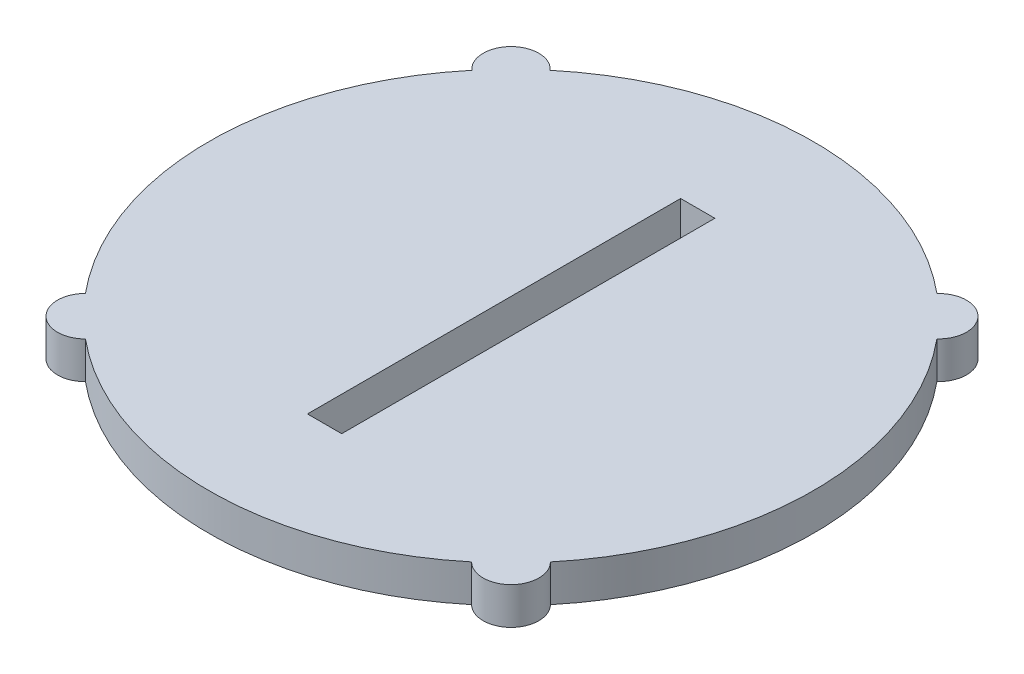
ISO-10303-21;
HEADER;
FILE_DESCRIPTION(('STEP AP214'),'2;1');
FILE_NAME('part.step','',(''),(''),'','','');
FILE_SCHEMA(('AUTOMOTIVE_DESIGN { 1 0 10303 214 1 1 1 1 }'));
ENDSEC;
DATA;
#1=APPLICATION_CONTEXT('core data for automotive mechanical design processes');
#2=APPLICATION_PROTOCOL_DEFINITION('international standard','automotive_design',2000,#1);
#3=PRODUCT_CONTEXT('',#1,'mechanical');
#4=PRODUCT('Part','Part','',(#3));
#5=PRODUCT_RELATED_PRODUCT_CATEGORY('part','',(#4));
#6=PRODUCT_DEFINITION_FORMATION('','',#4);
#7=PRODUCT_DEFINITION_CONTEXT('part definition',#1,'design');
#8=PRODUCT_DEFINITION('design','',#6,#7);
#9=PRODUCT_DEFINITION_SHAPE('','',#8);
#10=(LENGTH_UNIT() NAMED_UNIT(*) SI_UNIT(.MILLI.,.METRE.));
#11=(NAMED_UNIT(*) PLANE_ANGLE_UNIT() SI_UNIT($,.RADIAN.));
#12=(NAMED_UNIT(*) SI_UNIT($,.STERADIAN.) SOLID_ANGLE_UNIT());
#13=UNCERTAINTY_MEASURE_WITH_UNIT(LENGTH_MEASURE(1.E-05),#10,'distance_accuracy_value','');
#14=(GEOMETRIC_REPRESENTATION_CONTEXT(3) GLOBAL_UNCERTAINTY_ASSIGNED_CONTEXT((#13)) GLOBAL_UNIT_ASSIGNED_CONTEXT((#10,
#11,#12)) REPRESENTATION_CONTEXT('',''));
#15=CARTESIAN_POINT('',(0.,0.,0.));
#16=DIRECTION('',(0.,0.,1.));
#17=DIRECTION('',(1.,0.,0.));
#18=AXIS2_PLACEMENT_3D('',#15,#16,#17);
#19=CARTESIAN_POINT('',(0.,4.,-41.0330453563715));
#20=DIRECTION('',(0.,0.,-1.));
#21=DIRECTION('',(-1.,0.,0.));
#22=AXIS2_PLACEMENT_3D('',#19,#20,#21);
#23=PLANE('',#22);
#24=DIRECTION('',(1.,0.,0.));
#25=VECTOR('',#24,1.);
#26=CARTESIAN_POINT('',(0.,0.,-41.0330453563715));
#27=LINE('',#26,#25);
#28=CARTESIAN_POINT('',(-48.6027325556572,0.,-41.0330453563715));
#29=VERTEX_POINT('',#28);
#30=CARTESIAN_POINT('',(-44.9027325556572,0.,-41.0330453563715));
#31=VERTEX_POINT('',#30);
#32=EDGE_CURVE('E242',#29,#31,#27,.T.);
#33=ORIENTED_EDGE('',*,*,#32,.T.);
#34=DIRECTION('',(0.,-1.,0.));
#35=VECTOR('',#34,1.);
#36=CARTESIAN_POINT('',(-44.9027325556572,4.,-41.0330453563715));
#37=LINE('',#36,#35);
#38=CARTESIAN_POINT('',(-44.9027325556572,4.,-41.0330453563715));
#39=VERTEX_POINT('',#38);
#40=EDGE_CURVE('E12',#39,#31,#37,.T.);
#41=ORIENTED_EDGE('',*,*,#40,.F.);
#42=DIRECTION('',(1.,0.,0.));
#43=VECTOR('',#42,1.);
#44=CARTESIAN_POINT('',(0.,4.,-41.0330453563715));
#45=LINE('',#44,#43);
#46=CARTESIAN_POINT('',(-48.6027325556572,4.,-41.0330453563715));
#47=VERTEX_POINT('',#46);
#48=EDGE_CURVE('E138',#47,#39,#45,.T.);
#49=ORIENTED_EDGE('',*,*,#48,.F.);
#50=DIRECTION('',(0.,-1.,0.));
#51=VECTOR('',#50,1.);
#52=CARTESIAN_POINT('',(-48.6027325556572,4.,-41.0330453563715));
#53=LINE('',#52,#51);
#54=EDGE_CURVE('E54',#47,#29,#53,.T.);
#55=ORIENTED_EDGE('',*,*,#54,.T.);
#56=EDGE_LOOP('',(#33,#41,#49,#55));
#57=FACE_BOUND('',#56,.T.);
#58=ADVANCED_FACE('F35',(#57),#23,.F.);
#59=CARTESIAN_POINT('',(-44.9027325556572,4.,0.));
#60=DIRECTION('',(1.,0.,0.));
#61=DIRECTION('',(0.,0.,-1.));
#62=AXIS2_PLACEMENT_3D('',#59,#60,#61);
#63=PLANE('',#62);
#64=DIRECTION('',(0.,0.,1.));
#65=VECTOR('',#64,1.);
#66=CARTESIAN_POINT('',(-44.9027325556572,0.,0.));
#67=LINE('',#66,#65);
#68=CARTESIAN_POINT('',(-44.9027325556572,0.,-0.733045356371503));
#69=VERTEX_POINT('',#68);
#70=EDGE_CURVE('E144',#31,#69,#67,.T.);
#71=ORIENTED_EDGE('',*,*,#70,.T.);
#72=DIRECTION('',(0.,-1.,0.));
#73=VECTOR('',#72,1.);
#74=CARTESIAN_POINT('',(-44.9027325556572,4.,-0.733045356371503));
#75=LINE('',#74,#73);
#76=CARTESIAN_POINT('',(-44.9027325556572,4.,-0.733045356371503));
#77=VERTEX_POINT('',#76);
#78=EDGE_CURVE('E45',#77,#69,#75,.T.);
#79=ORIENTED_EDGE('',*,*,#78,.F.);
#80=DIRECTION('',(0.,0.,1.));
#81=VECTOR('',#80,1.);
#82=CARTESIAN_POINT('',(-44.9027325556572,4.,0.));
#83=LINE('',#82,#81);
#84=EDGE_CURVE('E132',#39,#77,#83,.T.);
#85=ORIENTED_EDGE('',*,*,#84,.F.);
#86=ORIENTED_EDGE('',*,*,#40,.T.);
#87=EDGE_LOOP('',(#71,#79,#85,#86));
#88=FACE_BOUND('',#87,.T.);
#89=ADVANCED_FACE('F143',(#88),#63,.F.);
#90=CARTESIAN_POINT('',(0.,4.,-0.733045356371511));
#91=DIRECTION('',(0.,0.,-1.));
#92=DIRECTION('',(-1.,0.,0.));
#93=AXIS2_PLACEMENT_3D('',#90,#91,#92);
#94=PLANE('',#93);
#95=DIRECTION('',(1.,0.,0.));
#96=VECTOR('',#95,1.);
#97=CARTESIAN_POINT('',(0.,0.,-0.733045356371511));
#98=LINE('',#97,#96);
#99=CARTESIAN_POINT('',(-48.6027325556572,0.,-0.733045356371503));
#100=VERTEX_POINT('',#99);
#101=EDGE_CURVE('E188',#100,#69,#98,.T.);
#102=ORIENTED_EDGE('',*,*,#101,.F.);
#103=DIRECTION('',(0.,-1.,0.));
#104=VECTOR('',#103,1.);
#105=CARTESIAN_POINT('',(-48.6027325556572,4.,-0.733045356371503));
#106=LINE('',#105,#104);
#107=CARTESIAN_POINT('',(-48.6027325556572,4.,-0.733045356371503));
#108=VERTEX_POINT('',#107);
#109=EDGE_CURVE('E92',#108,#100,#106,.T.);
#110=ORIENTED_EDGE('',*,*,#109,.F.);
#111=DIRECTION('',(1.,0.,0.));
#112=VECTOR('',#111,1.);
#113=CARTESIAN_POINT('',(0.,4.,-0.733045356371511));
#114=LINE('',#113,#112);
#115=EDGE_CURVE('E137',#108,#77,#114,.T.);
#116=ORIENTED_EDGE('',*,*,#115,.T.);
#117=ORIENTED_EDGE('',*,*,#78,.T.);
#118=EDGE_LOOP('',(#102,#110,#116,#117));
#119=FACE_BOUND('',#118,.T.);
#120=ADVANCED_FACE('F148',(#119),#94,.T.);
#121=CARTESIAN_POINT('',(-46.7527325556572,4.,-20.8830453563715));
#122=DIRECTION('',(0.,-1.,0.));
#123=DIRECTION('',(0.,0.,-1.));
#124=AXIS2_PLACEMENT_3D('',#121,#122,#123);
#125=CYLINDRICAL_SURFACE('',#124,32.65);
#126=CARTESIAN_POINT('',(-46.7527325556572,0.,-20.8830453563715));
#127=DIRECTION('',(0.,1.,0.));
#128=DIRECTION('',(0.,0.,1.));
#129=AXIS2_PLACEMENT_3D('',#126,#127,#128);
#130=CIRCLE('',#129,32.65);
#131=CARTESIAN_POINT('',(-67.6322437141358,0.,-45.9842109425144));
#132=VERTEX_POINT('',#131);
#133=CARTESIAN_POINT('',(-25.8732213971785,0.,-45.9842109425144));
#134=VERTEX_POINT('',#133);
#135=EDGE_CURVE('E219',#132,#134,#130,.F.);
#136=ORIENTED_EDGE('',*,*,#135,.F.);
#137=DIRECTION('',(0.,-1.,0.));
#138=VECTOR('',#137,1.);
#139=CARTESIAN_POINT('',(-67.6322437141358,4.,-45.9842109425144));
#140=LINE('',#139,#138);
#141=CARTESIAN_POINT('',(-67.6322437141358,4.,-45.9842109425144));
#142=VERTEX_POINT('',#141);
#143=EDGE_CURVE('E39',#142,#132,#140,.T.);
#144=ORIENTED_EDGE('',*,*,#143,.F.);
#145=CARTESIAN_POINT('',(-46.7527325556572,4.,-20.8830453563715));
#146=DIRECTION('',(0.,1.,0.));
#147=DIRECTION('',(0.,0.,1.));
#148=AXIS2_PLACEMENT_3D('',#145,#146,#147);
#149=CIRCLE('',#148,32.65);
#150=CARTESIAN_POINT('',(-25.8732213971785,4.,-45.9842109425144));
#151=VERTEX_POINT('',#150);
#152=EDGE_CURVE('E185',#142,#151,#149,.F.);
#153=ORIENTED_EDGE('',*,*,#152,.T.);
#154=DIRECTION('',(0.,-1.,0.));
#155=VECTOR('',#154,1.);
#156=CARTESIAN_POINT('',(-25.8732213971785,4.,-45.9842109425144));
#157=LINE('',#156,#155);
#158=EDGE_CURVE('E151',#151,#134,#157,.T.);
#159=ORIENTED_EDGE('',*,*,#158,.T.);
#160=EDGE_LOOP('',(#136,#144,#153,#159));
#161=FACE_BOUND('',#160,.T.);
#162=ADVANCED_FACE('F37',(#161),#125,.T.);
#163=CARTESIAN_POINT('',(-69.8480555889763,4.,-43.9617921591473));
#164=DIRECTION('',(0.,-1.,0.));
#165=DIRECTION('',(0.,0.,-1.));
#166=AXIS2_PLACEMENT_3D('',#163,#164,#165);
#167=CYLINDRICAL_SURFACE('',#166,3.);
#168=CARTESIAN_POINT('',(-69.8480555889763,0.,-43.9617921591473));
#169=DIRECTION('',(0.,1.,0.));
#170=DIRECTION('',(0.,0.,1.));
#171=AXIS2_PLACEMENT_3D('',#168,#169,#170);
#172=CIRCLE('',#171,3.);
#173=CARTESIAN_POINT('',(-71.8688829233405,0.,-41.7445287817638));
#174=VERTEX_POINT('',#173);
#175=EDGE_CURVE('E215',#174,#132,#172,.F.);
#176=ORIENTED_EDGE('',*,*,#175,.F.);
#177=DIRECTION('',(0.,-1.,0.));
#178=VECTOR('',#177,1.);
#179=CARTESIAN_POINT('',(-71.8688829233405,4.,-41.7445287817638));
#180=LINE('',#179,#178);
#181=CARTESIAN_POINT('',(-71.8688829233405,4.,-41.7445287817638));
#182=VERTEX_POINT('',#181);
#183=EDGE_CURVE('E208',#182,#174,#180,.T.);
#184=ORIENTED_EDGE('',*,*,#183,.F.);
#185=CARTESIAN_POINT('',(-69.8480555889763,4.,-43.9617921591473));
#186=DIRECTION('',(0.,1.,0.));
#187=DIRECTION('',(0.,0.,1.));
#188=AXIS2_PLACEMENT_3D('',#185,#186,#187);
#189=CIRCLE('',#188,3.);
#190=EDGE_CURVE('E182',#182,#142,#189,.F.);
#191=ORIENTED_EDGE('',*,*,#190,.T.);
#192=ORIENTED_EDGE('',*,*,#143,.T.);
#193=EDGE_LOOP('',(#176,#184,#191,#192));
#194=FACE_BOUND('',#193,.T.);
#195=ADVANCED_FACE('F213',(#194),#167,.T.);
#196=CARTESIAN_POINT('',(-46.7527325556572,4.,-20.8830453563715));
#197=DIRECTION('',(0.,-1.,0.));
#198=DIRECTION('',(0.,0.,-1.));
#199=AXIS2_PLACEMENT_3D('',#196,#197,#198);
#200=CYLINDRICAL_SURFACE('',#199,32.65);
#201=CARTESIAN_POINT('',(-46.7527325556572,0.,-20.8830453563715));
#202=DIRECTION('',(0.,1.,0.));
#203=DIRECTION('',(0.,0.,1.));
#204=AXIS2_PLACEMENT_3D('',#201,#202,#203);
#205=CIRCLE('',#204,32.65);
#206=CARTESIAN_POINT('',(-71.8627598280867,0.,-0.0141922403556378));
#207=VERTEX_POINT('',#206);
#208=EDGE_CURVE('E226',#207,#174,#205,.F.);
#209=ORIENTED_EDGE('',*,*,#208,.F.);
#210=DIRECTION('',(0.,-1.,0.));
#211=VECTOR('',#210,1.);
#212=CARTESIAN_POINT('',(-71.8627598280867,4.,-0.0141922403556378));
#213=LINE('',#212,#211);
#214=CARTESIAN_POINT('',(-71.8627598280867,4.,-0.0141922403556378));
#215=VERTEX_POINT('',#214);
#216=EDGE_CURVE('E207',#215,#207,#213,.T.);
#217=ORIENTED_EDGE('',*,*,#216,.F.);
#218=CARTESIAN_POINT('',(-46.7527325556572,4.,-20.8830453563715));
#219=DIRECTION('',(0.,1.,0.));
#220=DIRECTION('',(0.,0.,1.));
#221=AXIS2_PLACEMENT_3D('',#218,#219,#220);
#222=CIRCLE('',#221,32.65);
#223=EDGE_CURVE('E179',#215,#182,#222,.F.);
#224=ORIENTED_EDGE('',*,*,#223,.T.);
#225=ORIENTED_EDGE('',*,*,#183,.T.);
#226=EDGE_LOOP('',(#209,#217,#224,#225));
#227=FACE_BOUND('',#226,.T.);
#228=ADVANCED_FACE('F279',(#227),#200,.T.);
#229=CARTESIAN_POINT('',(-69.7331557034153,4.,2.11388340130279));
#230=DIRECTION('',(0.,-1.,0.));
#231=DIRECTION('',(0.,0.,-1.));
#232=AXIS2_PLACEMENT_3D('',#229,#230,#231);
#233=CYLINDRICAL_SURFACE('',#232,3.01063442889327);
#234=CARTESIAN_POINT('',(-69.7331557034153,0.,2.11388340130279));
#235=DIRECTION('',(0.,1.,0.));
#236=DIRECTION('',(0.,0.,1.));
#237=AXIS2_PLACEMENT_3D('',#234,#235,#236);
#238=CIRCLE('',#237,3.01063442889327);
#239=CARTESIAN_POINT('',(-67.6035515787438,0.,4.24195904296122));
#240=VERTEX_POINT('',#239);
#241=EDGE_CURVE('E228',#207,#240,#238,.T.);
#242=ORIENTED_EDGE('',*,*,#241,.T.);
#243=DIRECTION('',(0.,-1.,0.));
#244=VECTOR('',#243,1.);
#245=CARTESIAN_POINT('',(-67.6035515787438,4.,4.24195904296122));
#246=LINE('',#245,#244);
#247=CARTESIAN_POINT('',(-67.6035515787438,4.,4.24195904296122));
#248=VERTEX_POINT('',#247);
#249=EDGE_CURVE('E204',#248,#240,#246,.T.);
#250=ORIENTED_EDGE('',*,*,#249,.F.);
#251=CARTESIAN_POINT('',(-69.7331557034153,4.,2.11388340130279));
#252=DIRECTION('',(0.,1.,0.));
#253=DIRECTION('',(0.,0.,1.));
#254=AXIS2_PLACEMENT_3D('',#251,#252,#253);
#255=CIRCLE('',#254,3.01063442889327);
#256=EDGE_CURVE('E176',#215,#248,#255,.T.);
#257=ORIENTED_EDGE('',*,*,#256,.F.);
#258=ORIENTED_EDGE('',*,*,#216,.T.);
#259=EDGE_LOOP('',(#242,#250,#257,#258));
#260=FACE_BOUND('',#259,.T.);
#261=ADVANCED_FACE('F275',(#260),#233,.T.);
#262=CARTESIAN_POINT('',(-46.7527325556572,4.,-20.8830453563715));
#263=DIRECTION('',(0.,-1.,0.));
#264=DIRECTION('',(0.,0.,-1.));
#265=AXIS2_PLACEMENT_3D('',#262,#263,#264);
#266=CYLINDRICAL_SURFACE('',#265,32.65);
#267=CARTESIAN_POINT('',(-46.7527325556572,0.,-20.8830453563715));
#268=DIRECTION('',(0.,1.,0.));
#269=DIRECTION('',(0.,0.,1.));
#270=AXIS2_PLACEMENT_3D('',#267,#268,#269);
#271=CIRCLE('',#270,32.65);
#272=CARTESIAN_POINT('',(-25.9019135325705,0.,4.24195904296121));
#273=VERTEX_POINT('',#272);
#274=EDGE_CURVE('E232',#240,#273,#271,.T.);
#275=ORIENTED_EDGE('',*,*,#274,.T.);
#276=DIRECTION('',(0.,-1.,0.));
#277=VECTOR('',#276,1.);
#278=CARTESIAN_POINT('',(-25.9019135325705,4.,4.24195904296121));
#279=LINE('',#278,#277);
#280=CARTESIAN_POINT('',(-25.9019135325705,4.,4.24195904296121));
#281=VERTEX_POINT('',#280);
#282=EDGE_CURVE('E202',#281,#273,#279,.T.);
#283=ORIENTED_EDGE('',*,*,#282,.F.);
#284=CARTESIAN_POINT('',(-46.7527325556572,4.,-20.8830453563715));
#285=DIRECTION('',(0.,1.,0.));
#286=DIRECTION('',(0.,0.,1.));
#287=AXIS2_PLACEMENT_3D('',#284,#285,#286);
#288=CIRCLE('',#287,32.65);
#289=EDGE_CURVE('E174',#248,#281,#288,.T.);
#290=ORIENTED_EDGE('',*,*,#289,.F.);
#291=ORIENTED_EDGE('',*,*,#249,.T.);
#292=EDGE_LOOP('',(#275,#283,#290,#291));
#293=FACE_BOUND('',#292,.T.);
#294=ADVANCED_FACE('F271',(#293),#266,.T.);
#295=CARTESIAN_POINT('',(-23.7723094078991,4.,2.11388340130279));
#296=DIRECTION('',(0.,-1.,0.));
#297=DIRECTION('',(0.,0.,-1.));
#298=AXIS2_PLACEMENT_3D('',#295,#296,#297);
#299=CYLINDRICAL_SURFACE('',#298,3.01063442889327);
#300=CARTESIAN_POINT('',(-23.7723094078991,0.,2.11388340130279));
#301=DIRECTION('',(0.,1.,0.));
#302=DIRECTION('',(0.,0.,1.));
#303=AXIS2_PLACEMENT_3D('',#300,#301,#302);
#304=CIRCLE('',#303,3.01063442889327);
#305=CARTESIAN_POINT('',(-21.6427052832276,0.,-0.0141922403556378));
#306=VERTEX_POINT('',#305);
#307=EDGE_CURVE('E235',#306,#273,#304,.F.);
#308=ORIENTED_EDGE('',*,*,#307,.F.);
#309=DIRECTION('',(0.,-1.,0.));
#310=VECTOR('',#309,1.);
#311=CARTESIAN_POINT('',(-21.6427052832276,4.,-0.0141922403556378));
#312=LINE('',#311,#310);
#313=CARTESIAN_POINT('',(-21.6427052832276,4.,-0.0141922403556378));
#314=VERTEX_POINT('',#313);
#315=EDGE_CURVE('E200',#314,#306,#312,.T.);
#316=ORIENTED_EDGE('',*,*,#315,.F.);
#317=CARTESIAN_POINT('',(-23.7723094078991,4.,2.11388340130279));
#318=DIRECTION('',(0.,1.,0.));
#319=DIRECTION('',(0.,0.,1.));
#320=AXIS2_PLACEMENT_3D('',#317,#318,#319);
#321=CIRCLE('',#320,3.01063442889327);
#322=EDGE_CURVE('E169',#314,#281,#321,.F.);
#323=ORIENTED_EDGE('',*,*,#322,.T.);
#324=ORIENTED_EDGE('',*,*,#282,.T.);
#325=EDGE_LOOP('',(#308,#316,#323,#324));
#326=FACE_BOUND('',#325,.T.);
#327=ADVANCED_FACE('F267',(#326),#299,.T.);
#328=CARTESIAN_POINT('',(-46.7527325556572,4.,-20.8830453563715));
#329=DIRECTION('',(0.,-1.,0.));
#330=DIRECTION('',(0.,0.,-1.));
#331=AXIS2_PLACEMENT_3D('',#328,#329,#330);
#332=CYLINDRICAL_SURFACE('',#331,32.65);
#333=CARTESIAN_POINT('',(-46.7527325556572,0.,-20.8830453563715));
#334=DIRECTION('',(0.,1.,0.));
#335=DIRECTION('',(0.,0.,1.));
#336=AXIS2_PLACEMENT_3D('',#333,#334,#335);
#337=CIRCLE('',#336,32.65);
#338=CARTESIAN_POINT('',(-21.6365821879738,0.,-41.7445287817638));
#339=VERTEX_POINT('',#338);
#340=EDGE_CURVE('E238',#306,#339,#337,.T.);
#341=ORIENTED_EDGE('',*,*,#340,.T.);
#342=DIRECTION('',(0.,-1.,0.));
#343=VECTOR('',#342,1.);
#344=CARTESIAN_POINT('',(-21.6365821879738,4.,-41.7445287817638));
#345=LINE('',#344,#343);
#346=CARTESIAN_POINT('',(-21.6365821879738,4.,-41.7445287817638));
#347=VERTEX_POINT('',#346);
#348=EDGE_CURVE('E197',#347,#339,#345,.T.);
#349=ORIENTED_EDGE('',*,*,#348,.F.);
#350=CARTESIAN_POINT('',(-46.7527325556572,4.,-20.8830453563715));
#351=DIRECTION('',(0.,1.,0.));
#352=DIRECTION('',(0.,0.,1.));
#353=AXIS2_PLACEMENT_3D('',#350,#351,#352);
#354=CIRCLE('',#353,32.65);
#355=EDGE_CURVE('E166',#314,#347,#354,.T.);
#356=ORIENTED_EDGE('',*,*,#355,.F.);
#357=ORIENTED_EDGE('',*,*,#315,.T.);
#358=EDGE_LOOP('',(#341,#349,#356,#357));
#359=FACE_BOUND('',#358,.T.);
#360=ADVANCED_FACE('F253',(#359),#332,.T.);
#361=CARTESIAN_POINT('',(-23.657409522338,4.,-43.9617921591473));
#362=DIRECTION('',(0.,-1.,0.));
#363=DIRECTION('',(0.,0.,-1.));
#364=AXIS2_PLACEMENT_3D('',#361,#362,#363);
#365=CYLINDRICAL_SURFACE('',#364,3.);
#366=CARTESIAN_POINT('',(-23.657409522338,0.,-43.9617921591473));
#367=DIRECTION('',(0.,1.,0.));
#368=DIRECTION('',(0.,0.,1.));
#369=AXIS2_PLACEMENT_3D('',#366,#367,#368);
#370=CIRCLE('',#369,3.);
#371=EDGE_CURVE('E240',#339,#134,#370,.T.);
#372=ORIENTED_EDGE('',*,*,#371,.T.);
#373=ORIENTED_EDGE('',*,*,#158,.F.);
#374=CARTESIAN_POINT('',(-23.657409522338,4.,-43.9617921591473));
#375=DIRECTION('',(0.,1.,0.));
#376=DIRECTION('',(0.,0.,1.));
#377=AXIS2_PLACEMENT_3D('',#374,#375,#376);
#378=CIRCLE('',#377,3.);
#379=EDGE_CURVE('E163',#347,#151,#378,.T.);
#380=ORIENTED_EDGE('',*,*,#379,.F.);
#381=ORIENTED_EDGE('',*,*,#348,.T.);
#382=EDGE_LOOP('',(#372,#373,#380,#381));
#383=FACE_BOUND('',#382,.T.);
#384=ADVANCED_FACE('F245',(#383),#365,.T.);
#385=CARTESIAN_POINT('',(-48.6027325556572,4.,0.));
#386=DIRECTION('',(1.,0.,0.));
#387=DIRECTION('',(0.,0.,-1.));
#388=AXIS2_PLACEMENT_3D('',#385,#386,#387);
#389=PLANE('',#388);
#390=DIRECTION('',(0.,0.,1.));
#391=VECTOR('',#390,1.);
#392=CARTESIAN_POINT('',(-48.6027325556572,0.,0.));
#393=LINE('',#392,#391);
#394=EDGE_CURVE('E186',#29,#100,#393,.T.);
#395=ORIENTED_EDGE('',*,*,#394,.F.);
#396=ORIENTED_EDGE('',*,*,#54,.F.);
#397=DIRECTION('',(0.,0.,1.));
#398=VECTOR('',#397,1.);
#399=CARTESIAN_POINT('',(-48.6027325556572,4.,0.));
#400=LINE('',#399,#398);
#401=EDGE_CURVE('E149',#47,#108,#400,.T.);
#402=ORIENTED_EDGE('',*,*,#401,.T.);
#403=ORIENTED_EDGE('',*,*,#109,.T.);
#404=EDGE_LOOP('',(#395,#396,#402,#403));
#405=FACE_BOUND('',#404,.T.);
#406=ADVANCED_FACE('F243',(#405),#389,.T.);
#407=CARTESIAN_POINT('',(0.,4.,0.));
#408=DIRECTION('',(0.,1.,0.));
#409=DIRECTION('',(0.,0.,1.));
#410=AXIS2_PLACEMENT_3D('',#407,#408,#409);
#411=PLANE('',#410);
#412=ORIENTED_EDGE('',*,*,#152,.F.);
#413=ORIENTED_EDGE('',*,*,#190,.F.);
#414=ORIENTED_EDGE('',*,*,#223,.F.);
#415=ORIENTED_EDGE('',*,*,#256,.T.);
#416=ORIENTED_EDGE('',*,*,#289,.T.);
#417=ORIENTED_EDGE('',*,*,#322,.F.);
#418=ORIENTED_EDGE('',*,*,#355,.T.);
#419=ORIENTED_EDGE('',*,*,#379,.T.);
#420=EDGE_LOOP('',(#412,#413,#414,#415,#416,#417,#418,#419));
#421=FACE_BOUND('',#420,.T.);
#422=ORIENTED_EDGE('',*,*,#48,.T.);
#423=ORIENTED_EDGE('',*,*,#84,.T.);
#424=ORIENTED_EDGE('',*,*,#115,.F.);
#425=ORIENTED_EDGE('',*,*,#401,.F.);
#426=EDGE_LOOP('',(#422,#423,#424,#425));
#427=FACE_BOUND('',#426,.T.);
#428=ADVANCED_FACE('F134',(#421,#427),#411,.T.);
#429=CARTESIAN_POINT('',(0.,0.,0.));
#430=DIRECTION('',(0.,1.,0.));
#431=DIRECTION('',(0.,0.,1.));
#432=AXIS2_PLACEMENT_3D('',#429,#430,#431);
#433=PLANE('',#432);
#434=ORIENTED_EDGE('',*,*,#135,.T.);
#435=ORIENTED_EDGE('',*,*,#371,.F.);
#436=ORIENTED_EDGE('',*,*,#340,.F.);
#437=ORIENTED_EDGE('',*,*,#307,.T.);
#438=ORIENTED_EDGE('',*,*,#274,.F.);
#439=ORIENTED_EDGE('',*,*,#241,.F.);
#440=ORIENTED_EDGE('',*,*,#208,.T.);
#441=ORIENTED_EDGE('',*,*,#175,.T.);
#442=EDGE_LOOP('',(#434,#435,#436,#437,#438,#439,#440,#441));
#443=FACE_BOUND('',#442,.T.);
#444=ORIENTED_EDGE('',*,*,#32,.F.);
#445=ORIENTED_EDGE('',*,*,#394,.T.);
#446=ORIENTED_EDGE('',*,*,#101,.T.);
#447=ORIENTED_EDGE('',*,*,#70,.F.);
#448=EDGE_LOOP('',(#444,#445,#446,#447));
#449=FACE_BOUND('',#448,.T.);
#450=ADVANCED_FACE('F224',(#443,#449),#433,.F.);
#451=CLOSED_SHELL('',(#58,#89,#120,#162,#195,#228,#261,#294,#327,#360,#384,#406,#428,#450));
#452=MANIFOLD_SOLID_BREP('B2',#451);
#453=ADVANCED_BREP_SHAPE_REPRESENTATION('',(#18,#452),#14);
#454=SHAPE_DEFINITION_REPRESENTATION(#9,#453);
ENDSEC;
END-ISO-10303-21;
